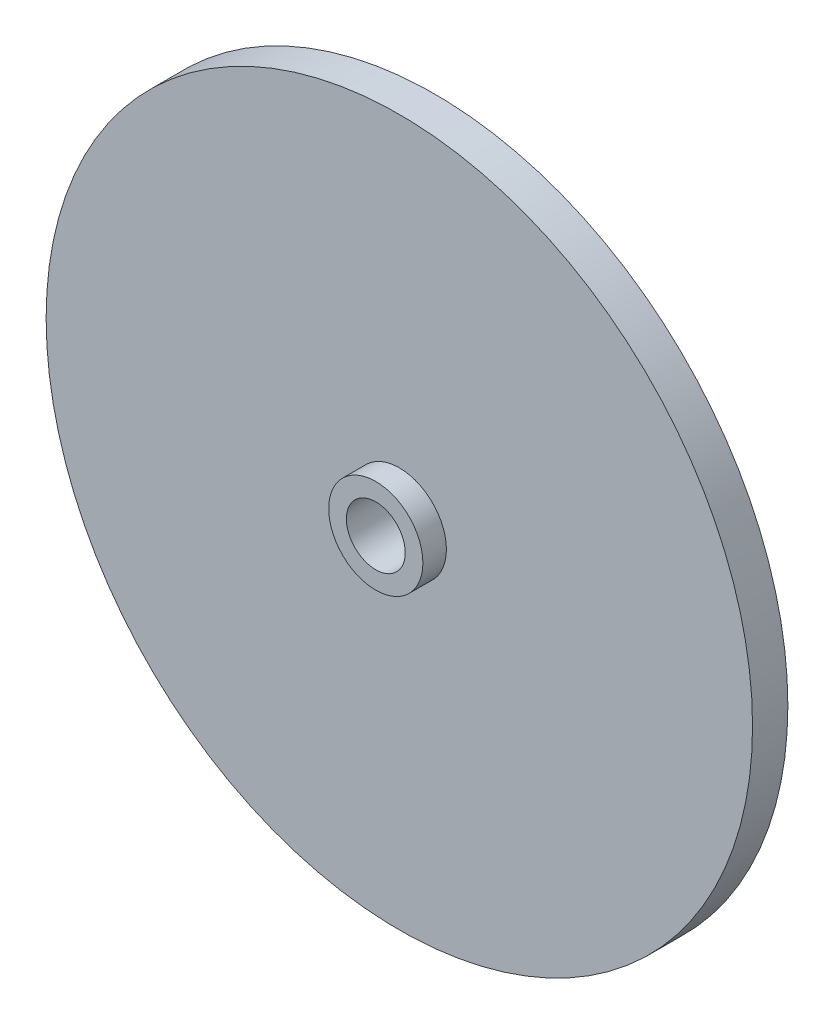
ISO-10303-21;
HEADER;
FILE_DESCRIPTION(('STEP AP214'),'2;1');
FILE_NAME('part.step','',(''),(''),'','','');
FILE_SCHEMA(('AUTOMOTIVE_DESIGN { 1 0 10303 214 1 1 1 1 }'));
ENDSEC;
DATA;
#1=APPLICATION_CONTEXT('core data for automotive mechanical design processes');
#2=APPLICATION_PROTOCOL_DEFINITION('international standard','automotive_design',2000,#1);
#3=PRODUCT_CONTEXT('',#1,'mechanical');
#4=PRODUCT('Part','Part','',(#3));
#5=PRODUCT_RELATED_PRODUCT_CATEGORY('part','',(#4));
#6=PRODUCT_DEFINITION_FORMATION('','',#4);
#7=PRODUCT_DEFINITION_CONTEXT('part definition',#1,'design');
#8=PRODUCT_DEFINITION('design','',#6,#7);
#9=PRODUCT_DEFINITION_SHAPE('','',#8);
#10=(LENGTH_UNIT() NAMED_UNIT(*) SI_UNIT(.MILLI.,.METRE.));
#11=(NAMED_UNIT(*) PLANE_ANGLE_UNIT() SI_UNIT($,.RADIAN.));
#12=(NAMED_UNIT(*) SI_UNIT($,.STERADIAN.) SOLID_ANGLE_UNIT());
#13=UNCERTAINTY_MEASURE_WITH_UNIT(LENGTH_MEASURE(1.E-05),#10,'distance_accuracy_value','');
#14=(GEOMETRIC_REPRESENTATION_CONTEXT(3) GLOBAL_UNCERTAINTY_ASSIGNED_CONTEXT((#13)) GLOBAL_UNIT_ASSIGNED_CONTEXT((#10,
#11,#12)) REPRESENTATION_CONTEXT('',''));
#15=CARTESIAN_POINT('',(0.,0.,0.));
#16=DIRECTION('',(0.,0.,1.));
#17=DIRECTION('',(1.,0.,0.));
#18=AXIS2_PLACEMENT_3D('',#15,#16,#17);
#19=CARTESIAN_POINT('',(0.,0.,25.));
#20=DIRECTION('',(0.,0.,1.));
#21=DIRECTION('',(1.,0.,0.));
#22=AXIS2_PLACEMENT_3D('',#19,#20,#21);
#23=PLANE('',#22);
#24=CARTESIAN_POINT('',(0.,0.,25.));
#25=DIRECTION('',(0.,0.,1.));
#26=DIRECTION('',(1.,0.,0.));
#27=AXIS2_PLACEMENT_3D('',#24,#25,#26);
#28=CIRCLE('',#27,20.);
#29=CARTESIAN_POINT('',(20.,0.,25.));
#30=VERTEX_POINT('',#29);
#31=EDGE_CURVE('E19',#30,#30,#28,.T.);
#32=ORIENTED_EDGE('',*,*,#31,.F.);
#33=EDGE_LOOP('',(#32));
#34=FACE_BOUND('',#33,.T.);
#35=CARTESIAN_POINT('',(0.,0.,25.));
#36=DIRECTION('',(0.,0.,1.));
#37=DIRECTION('',(1.,0.,0.));
#38=AXIS2_PLACEMENT_3D('',#35,#36,#37);
#39=CIRCLE('',#38,150.);
#40=CARTESIAN_POINT('',(150.,0.,25.));
#41=VERTEX_POINT('',#40);
#42=EDGE_CURVE('E42',#41,#41,#39,.T.);
#43=ORIENTED_EDGE('',*,*,#42,.T.);
#44=EDGE_LOOP('',(#43));
#45=FACE_BOUND('',#44,.T.);
#46=ADVANCED_FACE('F16',(#34,#45),#23,.T.);
#47=CARTESIAN_POINT('',(0.,0.,25.));
#48=DIRECTION('',(0.,0.,1.));
#49=DIRECTION('',(1.,0.,0.));
#50=AXIS2_PLACEMENT_3D('',#47,#48,#49);
#51=CYLINDRICAL_SURFACE('',#50,20.);
#52=ORIENTED_EDGE('',*,*,#31,.T.);
#53=DIRECTION('',(0.,0.,1.));
#54=VECTOR('',#53,1.);
#55=CARTESIAN_POINT('',(20.,0.,25.));
#56=LINE('',#55,#54);
#57=CARTESIAN_POINT('',(20.,0.,35.));
#58=VERTEX_POINT('',#57);
#59=EDGE_CURVE('E10',#30,#58,#56,.T.);
#60=ORIENTED_EDGE('',*,*,#59,.T.);
#61=CARTESIAN_POINT('',(0.,0.,35.));
#62=DIRECTION('',(0.,0.,1.));
#63=DIRECTION('',(1.,0.,0.));
#64=AXIS2_PLACEMENT_3D('',#61,#62,#63);
#65=CIRCLE('',#64,20.);
#66=EDGE_CURVE('E319',#58,#58,#65,.T.);
#67=ORIENTED_EDGE('',*,*,#66,.F.);
#68=ORIENTED_EDGE('',*,*,#59,.F.);
#69=EDGE_LOOP('',(#52,#60,#67,#68));
#70=FACE_BOUND('',#69,.T.);
#71=ADVANCED_FACE('F332',(#70),#51,.T.);
#72=CARTESIAN_POINT('',(0.,0.,10.));
#73=DIRECTION('',(0.,0.,1.));
#74=DIRECTION('',(1.,0.,0.));
#75=AXIS2_PLACEMENT_3D('',#72,#73,#74);
#76=CYLINDRICAL_SURFACE('',#75,150.);
#77=CARTESIAN_POINT('',(0.,0.,10.));
#78=DIRECTION('',(0.,0.,1.));
#79=DIRECTION('',(1.,0.,0.));
#80=AXIS2_PLACEMENT_3D('',#77,#78,#79);
#81=CIRCLE('',#80,150.);
#82=CARTESIAN_POINT('',(150.,0.,10.));
#83=VERTEX_POINT('',#82);
#84=EDGE_CURVE('E312',#83,#83,#81,.T.);
#85=ORIENTED_EDGE('',*,*,#84,.T.);
#86=DIRECTION('',(0.,0.,1.));
#87=VECTOR('',#86,1.);
#88=CARTESIAN_POINT('',(150.,0.,10.));
#89=LINE('',#88,#87);
#90=EDGE_CURVE('E323',#83,#41,#89,.T.);
#91=ORIENTED_EDGE('',*,*,#90,.T.);
#92=ORIENTED_EDGE('',*,*,#42,.F.);
#93=ORIENTED_EDGE('',*,*,#90,.F.);
#94=EDGE_LOOP('',(#85,#91,#92,#93));
#95=FACE_BOUND('',#94,.T.);
#96=ADVANCED_FACE('F339',(#95),#76,.T.);
#97=CARTESIAN_POINT('',(0.,0.,0.));
#98=DIRECTION('',(0.,0.,1.));
#99=DIRECTION('',(1.,0.,0.));
#100=AXIS2_PLACEMENT_3D('',#97,#98,#99);
#101=CYLINDRICAL_SURFACE('',#100,20.);
#102=DIRECTION('',(0.,0.,1.));
#103=VECTOR('',#102,1.);
#104=CARTESIAN_POINT('',(-1.5,19.943670675179,0.));
#105=LINE('',#104,#103);
#106=CARTESIAN_POINT('',(-1.5,19.943670675179,0.));
#107=VERTEX_POINT('',#106);
#108=CARTESIAN_POINT('',(-1.5,19.943670675179,10.));
#109=VERTEX_POINT('',#108);
#110=EDGE_CURVE('E283',#107,#109,#105,.T.);
#111=ORIENTED_EDGE('',*,*,#110,.F.);
#112=CARTESIAN_POINT('',(0.,0.,0.));
#113=DIRECTION('',(0.,0.,1.));
#114=DIRECTION('',(1.,0.,0.));
#115=AXIS2_PLACEMENT_3D('',#112,#113,#114);
#116=CIRCLE('',#115,20.);
#117=CARTESIAN_POINT('',(-1.5,-19.94367067517,0.));
#118=VERTEX_POINT('',#117);
#119=EDGE_CURVE('E203',#107,#118,#116,.T.);
#120=ORIENTED_EDGE('',*,*,#119,.T.);
#121=DIRECTION('',(0.,0.,1.));
#122=VECTOR('',#121,1.);
#123=CARTESIAN_POINT('',(-1.5,-19.94367067517,0.));
#124=LINE('',#123,#122);
#125=CARTESIAN_POINT('',(-1.5,-19.94367067517,10.));
#126=VERTEX_POINT('',#125);
#127=EDGE_CURVE('E297',#118,#126,#124,.T.);
#128=ORIENTED_EDGE('',*,*,#127,.T.);
#129=CARTESIAN_POINT('',(0.,0.,10.));
#130=DIRECTION('',(0.,0.,1.));
#131=DIRECTION('',(1.,0.,0.));
#132=AXIS2_PLACEMENT_3D('',#129,#130,#131);
#133=CIRCLE('',#132,20.);
#134=EDGE_CURVE('E316',#109,#126,#133,.T.);
#135=ORIENTED_EDGE('',*,*,#134,.F.);
#136=EDGE_LOOP('',(#111,#120,#128,#135));
#137=FACE_BOUND('',#136,.T.);
#138=ADVANCED_FACE('F344',(#137),#101,.T.);
#139=CARTESIAN_POINT('',(0.,0.,20.));
#140=DIRECTION('',(0.,0.,1.));
#141=DIRECTION('',(1.,0.,0.));
#142=AXIS2_PLACEMENT_3D('',#139,#140,#141);
#143=PLANE('',#142);
#144=DIRECTION('',(0.,-1.,0.));
#145=VECTOR('',#144,1.);
#146=CARTESIAN_POINT('',(-1.5,60.,20.));
#147=LINE('',#146,#145);
#148=CARTESIAN_POINT('',(-1.5,12.409673645991,20.));
#149=VERTEX_POINT('',#148);
#150=CARTESIAN_POINT('',(-1.5,-12.40967364599,20.));
#151=VERTEX_POINT('',#150);
#152=EDGE_CURVE('E245',#149,#151,#147,.T.);
#153=ORIENTED_EDGE('',*,*,#152,.T.);
#154=CARTESIAN_POINT('',(0.,0.,20.));
#155=DIRECTION('',(0.,0.,-1.));
#156=DIRECTION('',(1.,0.,0.));
#157=AXIS2_PLACEMENT_3D('',#154,#155,#156);
#158=CIRCLE('',#157,12.5);
#159=CARTESIAN_POINT('',(1.5,-12.40967364599,20.));
#160=VERTEX_POINT('',#159);
#161=EDGE_CURVE('E220',#160,#151,#158,.T.);
#162=ORIENTED_EDGE('',*,*,#161,.F.);
#163=DIRECTION('',(0.,1.,0.));
#164=VECTOR('',#163,1.);
#165=CARTESIAN_POINT('',(1.5,-60.,20.));
#166=LINE('',#165,#164);
#167=CARTESIAN_POINT('',(1.5,12.409673645991,20.));
#168=VERTEX_POINT('',#167);
#169=EDGE_CURVE('E267',#160,#168,#166,.T.);
#170=ORIENTED_EDGE('',*,*,#169,.T.);
#171=CARTESIAN_POINT('',(0.,0.,20.));
#172=DIRECTION('',(0.,0.,-1.));
#173=DIRECTION('',(1.,0.,0.));
#174=AXIS2_PLACEMENT_3D('',#171,#172,#173);
#175=CIRCLE('',#174,12.5);
#176=EDGE_CURVE('E257',#149,#168,#175,.T.);
#177=ORIENTED_EDGE('',*,*,#176,.F.);
#178=EDGE_LOOP('',(#153,#162,#170,#177));
#179=FACE_BOUND('',#178,.T.);
#180=ADVANCED_FACE('F356',(#179),#143,.T.);
#181=CARTESIAN_POINT('',(0.,0.,35.));
#182=DIRECTION('',(0.,0.,1.));
#183=DIRECTION('',(1.,0.,0.));
#184=AXIS2_PLACEMENT_3D('',#181,#182,#183);
#185=PLANE('',#184);
#186=CARTESIAN_POINT('',(0.,0.,35.));
#187=DIRECTION('',(0.,0.,-1.));
#188=DIRECTION('',(1.,0.,0.));
#189=AXIS2_PLACEMENT_3D('',#186,#187,#188);
#190=CIRCLE('',#189,12.5);
#191=CARTESIAN_POINT('',(12.5,0.,35.));
#192=VERTEX_POINT('',#191);
#193=EDGE_CURVE('E264',#192,#192,#190,.T.);
#194=ORIENTED_EDGE('',*,*,#193,.T.);
#195=EDGE_LOOP('',(#194));
#196=FACE_BOUND('',#195,.T.);
#197=ORIENTED_EDGE('',*,*,#66,.T.);
#198=EDGE_LOOP('',(#197));
#199=FACE_BOUND('',#198,.T.);
#200=ADVANCED_FACE('F354',(#196,#199),#185,.T.);
#201=CARTESIAN_POINT('',(0.,0.,10.));
#202=DIRECTION('',(0.,0.,1.));
#203=DIRECTION('',(1.,0.,0.));
#204=AXIS2_PLACEMENT_3D('',#201,#202,#203);
#205=PLANE('',#204);
#206=DIRECTION('',(0.,1.,0.));
#207=VECTOR('',#206,1.);
#208=CARTESIAN_POINT('',(1.5,-30.,10.));
#209=LINE('',#208,#207);
#210=CARTESIAN_POINT('',(1.5,-60.,10.));
#211=VERTEX_POINT('',#210);
#212=CARTESIAN_POINT('',(1.5,-19.94367067517,10.));
#213=VERTEX_POINT('',#212);
#214=EDGE_CURVE('E309',#211,#213,#209,.T.);
#215=ORIENTED_EDGE('',*,*,#214,.T.);
#216=CARTESIAN_POINT('',(0.,0.,10.));
#217=DIRECTION('',(0.,0.,-1.));
#218=DIRECTION('',(0.0749999999999967,0.997183533758957,0.));
#219=AXIS2_PLACEMENT_3D('',#216,#217,#218);
#220=CIRCLE('',#219,20.);
#221=CARTESIAN_POINT('',(1.5,19.943670675179,10.));
#222=VERTEX_POINT('',#221);
#223=EDGE_CURVE('E233',#222,#213,#220,.T.);
#224=ORIENTED_EDGE('',*,*,#223,.F.);
#225=DIRECTION('',(0.,1.,0.));
#226=VECTOR('',#225,1.);
#227=CARTESIAN_POINT('',(1.5,-30.,10.));
#228=LINE('',#227,#226);
#229=CARTESIAN_POINT('',(1.5,60.,10.));
#230=VERTEX_POINT('',#229);
#231=EDGE_CURVE('E164',#222,#230,#228,.T.);
#232=ORIENTED_EDGE('',*,*,#231,.T.);
#233=DIRECTION('',(-1.,0.,0.));
#234=VECTOR('',#233,1.);
#235=CARTESIAN_POINT('',(0.75,60.,10.));
#236=LINE('',#235,#234);
#237=CARTESIAN_POINT('',(-1.5,60.,10.));
#238=VERTEX_POINT('',#237);
#239=EDGE_CURVE('E279',#230,#238,#236,.T.);
#240=ORIENTED_EDGE('',*,*,#239,.T.);
#241=DIRECTION('',(0.,-1.,0.));
#242=VECTOR('',#241,1.);
#243=CARTESIAN_POINT('',(-1.5,30.,10.));
#244=LINE('',#243,#242);
#245=EDGE_CURVE('E249',#238,#109,#244,.T.);
#246=ORIENTED_EDGE('',*,*,#245,.T.);
#247=ORIENTED_EDGE('',*,*,#134,.T.);
#248=DIRECTION('',(0.,-1.,0.));
#249=VECTOR('',#248,1.);
#250=CARTESIAN_POINT('',(-1.5,30.,10.));
#251=LINE('',#250,#249);
#252=CARTESIAN_POINT('',(-1.5,-60.,10.));
#253=VERTEX_POINT('',#252);
#254=EDGE_CURVE('E293',#126,#253,#251,.T.);
#255=ORIENTED_EDGE('',*,*,#254,.T.);
#256=DIRECTION('',(1.,0.,0.));
#257=VECTOR('',#256,1.);
#258=CARTESIAN_POINT('',(-0.75,-60.,10.));
#259=LINE('',#258,#257);
#260=EDGE_CURVE('E305',#253,#211,#259,.T.);
#261=ORIENTED_EDGE('',*,*,#260,.T.);
#262=EDGE_LOOP('',(#215,#224,#232,#240,#246,#247,#255,#261));
#263=FACE_BOUND('',#262,.T.);
#264=ORIENTED_EDGE('',*,*,#84,.F.);
#265=EDGE_LOOP('',(#264));
#266=FACE_BOUND('',#265,.T.);
#267=ADVANCED_FACE('F350',(#263,#266),#205,.F.);
#268=CARTESIAN_POINT('',(1.5,-60.,0.));
#269=DIRECTION('',(-1.,0.,0.));
#270=DIRECTION('',(0.,0.,1.));
#271=AXIS2_PLACEMENT_3D('',#268,#269,#270);
#272=PLANE('',#271);
#273=DIRECTION('',(0.,0.,1.));
#274=VECTOR('',#273,1.);
#275=CARTESIAN_POINT('',(1.5,-19.94367067517,0.));
#276=LINE('',#275,#274);
#277=CARTESIAN_POINT('',(1.5,-19.94367067517,0.));
#278=VERTEX_POINT('',#277);
#279=EDGE_CURVE('E171',#278,#213,#276,.T.);
#280=ORIENTED_EDGE('',*,*,#279,.T.);
#281=ORIENTED_EDGE('',*,*,#214,.F.);
#282=DIRECTION('',(0.,0.,1.));
#283=VECTOR('',#282,1.);
#284=CARTESIAN_POINT('',(1.5,-60.,0.));
#285=LINE('',#284,#283);
#286=CARTESIAN_POINT('',(1.5,-60.,0.));
#287=VERTEX_POINT('',#286);
#288=EDGE_CURVE('E301',#287,#211,#285,.T.);
#289=ORIENTED_EDGE('',*,*,#288,.F.);
#290=DIRECTION('',(0.,1.,0.));
#291=VECTOR('',#290,1.);
#292=CARTESIAN_POINT('',(1.5,-60.,0.));
#293=LINE('',#292,#291);
#294=EDGE_CURVE('E188',#287,#278,#293,.T.);
#295=ORIENTED_EDGE('',*,*,#294,.T.);
#296=EDGE_LOOP('',(#280,#281,#289,#295));
#297=FACE_BOUND('',#296,.T.);
#298=ADVANCED_FACE('F353',(#297),#272,.F.);
#299=CARTESIAN_POINT('',(-1.5,-60.,0.));
#300=DIRECTION('',(0.,1.,0.));
#301=DIRECTION('',(1.,0.,0.));
#302=AXIS2_PLACEMENT_3D('',#299,#300,#301);
#303=PLANE('',#302);
#304=ORIENTED_EDGE('',*,*,#288,.T.);
#305=ORIENTED_EDGE('',*,*,#260,.F.);
#306=DIRECTION('',(0.,0.,1.));
#307=VECTOR('',#306,1.);
#308=CARTESIAN_POINT('',(-1.5,-60.,0.));
#309=LINE('',#308,#307);
#310=CARTESIAN_POINT('',(-1.5,-60.,0.));
#311=VERTEX_POINT('',#310);
#312=EDGE_CURVE('E248',#311,#253,#309,.T.);
#313=ORIENTED_EDGE('',*,*,#312,.F.);
#314=DIRECTION('',(1.,0.,0.));
#315=VECTOR('',#314,1.);
#316=CARTESIAN_POINT('',(-1.5,-60.,0.));
#317=LINE('',#316,#315);
#318=EDGE_CURVE('E193',#311,#287,#317,.T.);
#319=ORIENTED_EDGE('',*,*,#318,.T.);
#320=EDGE_LOOP('',(#304,#305,#313,#319));
#321=FACE_BOUND('',#320,.T.);
#322=ADVANCED_FACE('F387',(#321),#303,.F.);
#323=CARTESIAN_POINT('',(-1.5,60.,0.));
#324=DIRECTION('',(1.,0.,0.));
#325=DIRECTION('',(0.,1.,0.));
#326=AXIS2_PLACEMENT_3D('',#323,#324,#325);
#327=PLANE('',#326);
#328=ORIENTED_EDGE('',*,*,#312,.T.);
#329=ORIENTED_EDGE('',*,*,#254,.F.);
#330=ORIENTED_EDGE('',*,*,#127,.F.);
#331=DIRECTION('',(0.,-1.,0.));
#332=VECTOR('',#331,1.);
#333=CARTESIAN_POINT('',(-1.5,60.,0.));
#334=LINE('',#333,#332);
#335=EDGE_CURVE('E198',#118,#311,#334,.T.);
#336=ORIENTED_EDGE('',*,*,#335,.T.);
#337=EDGE_LOOP('',(#328,#329,#330,#336));
#338=FACE_BOUND('',#337,.T.);
#339=ADVANCED_FACE('F370',(#338),#327,.F.);
#340=CARTESIAN_POINT('',(-1.5,60.,0.));
#341=DIRECTION('',(1.,0.,0.));
#342=DIRECTION('',(0.,1.,0.));
#343=AXIS2_PLACEMENT_3D('',#340,#341,#342);
#344=PLANE('',#343);
#345=DIRECTION('',(0.,0.,-1.));
#346=VECTOR('',#345,1.);
#347=CARTESIAN_POINT('',(-1.5,-12.40967364599,0.));
#348=LINE('',#347,#346);
#349=CARTESIAN_POINT('',(-1.5,-12.40967364599,0.));
#350=VERTEX_POINT('',#349);
#351=EDGE_CURVE('E216',#151,#350,#348,.T.);
#352=ORIENTED_EDGE('',*,*,#351,.F.);
#353=ORIENTED_EDGE('',*,*,#152,.F.);
#354=DIRECTION('',(0.,0.,-1.));
#355=VECTOR('',#354,1.);
#356=CARTESIAN_POINT('',(-1.5,12.409673645991,0.));
#357=LINE('',#356,#355);
#358=CARTESIAN_POINT('',(-1.5,12.409673645991,0.));
#359=VERTEX_POINT('',#358);
#360=EDGE_CURVE('E219',#149,#359,#357,.T.);
#361=ORIENTED_EDGE('',*,*,#360,.T.);
#362=DIRECTION('',(0.,-1.,0.));
#363=VECTOR('',#362,1.);
#364=CARTESIAN_POINT('',(-1.5,60.,0.));
#365=LINE('',#364,#363);
#366=EDGE_CURVE('E228',#359,#350,#365,.T.);
#367=ORIENTED_EDGE('',*,*,#366,.T.);
#368=EDGE_LOOP('',(#352,#353,#361,#367));
#369=FACE_BOUND('',#368,.T.);
#370=ADVANCED_FACE('F348',(#369),#344,.F.);
#371=CARTESIAN_POINT('',(-1.5,60.,0.));
#372=DIRECTION('',(1.,0.,0.));
#373=DIRECTION('',(0.,1.,0.));
#374=AXIS2_PLACEMENT_3D('',#371,#372,#373);
#375=PLANE('',#374);
#376=ORIENTED_EDGE('',*,*,#110,.T.);
#377=ORIENTED_EDGE('',*,*,#245,.F.);
#378=DIRECTION('',(0.,0.,1.));
#379=VECTOR('',#378,1.);
#380=CARTESIAN_POINT('',(-1.5,60.,0.));
#381=LINE('',#380,#379);
#382=CARTESIAN_POINT('',(-1.5,60.,0.));
#383=VERTEX_POINT('',#382);
#384=EDGE_CURVE('E275',#383,#238,#381,.T.);
#385=ORIENTED_EDGE('',*,*,#384,.F.);
#386=DIRECTION('',(0.,-1.,0.));
#387=VECTOR('',#386,1.);
#388=CARTESIAN_POINT('',(-1.5,60.,0.));
#389=LINE('',#388,#387);
#390=EDGE_CURVE('E199',#383,#107,#389,.T.);
#391=ORIENTED_EDGE('',*,*,#390,.T.);
#392=EDGE_LOOP('',(#376,#377,#385,#391));
#393=FACE_BOUND('',#392,.T.);
#394=ADVANCED_FACE('F367',(#393),#375,.F.);
#395=CARTESIAN_POINT('',(1.5,60.,0.));
#396=DIRECTION('',(0.,-1.,0.));
#397=DIRECTION('',(0.,0.,-1.));
#398=AXIS2_PLACEMENT_3D('',#395,#396,#397);
#399=PLANE('',#398);
#400=ORIENTED_EDGE('',*,*,#384,.T.);
#401=ORIENTED_EDGE('',*,*,#239,.F.);
#402=DIRECTION('',(0.,0.,1.));
#403=VECTOR('',#402,1.);
#404=CARTESIAN_POINT('',(1.5,60.,0.));
#405=LINE('',#404,#403);
#406=CARTESIAN_POINT('',(1.5,60.,0.));
#407=VERTEX_POINT('',#406);
#408=EDGE_CURVE('E270',#407,#230,#405,.T.);
#409=ORIENTED_EDGE('',*,*,#408,.F.);
#410=DIRECTION('',(-1.,0.,0.));
#411=VECTOR('',#410,1.);
#412=CARTESIAN_POINT('',(1.5,60.,0.));
#413=LINE('',#412,#411);
#414=EDGE_CURVE('E180',#407,#383,#413,.T.);
#415=ORIENTED_EDGE('',*,*,#414,.T.);
#416=EDGE_LOOP('',(#400,#401,#409,#415));
#417=FACE_BOUND('',#416,.T.);
#418=ADVANCED_FACE('F374',(#417),#399,.F.);
#419=CARTESIAN_POINT('',(1.5,-60.,0.));
#420=DIRECTION('',(-1.,0.,0.));
#421=DIRECTION('',(0.,0.,1.));
#422=AXIS2_PLACEMENT_3D('',#419,#420,#421);
#423=PLANE('',#422);
#424=ORIENTED_EDGE('',*,*,#408,.T.);
#425=ORIENTED_EDGE('',*,*,#231,.F.);
#426=DIRECTION('',(0.,0.,1.));
#427=VECTOR('',#426,1.);
#428=CARTESIAN_POINT('',(1.5,19.943670675179,0.));
#429=LINE('',#428,#427);
#430=CARTESIAN_POINT('',(1.5,19.943670675179,0.));
#431=VERTEX_POINT('',#430);
#432=EDGE_CURVE('E157',#431,#222,#429,.T.);
#433=ORIENTED_EDGE('',*,*,#432,.F.);
#434=DIRECTION('',(0.,1.,0.));
#435=VECTOR('',#434,1.);
#436=CARTESIAN_POINT('',(1.5,-60.,0.));
#437=LINE('',#436,#435);
#438=EDGE_CURVE('E161',#431,#407,#437,.T.);
#439=ORIENTED_EDGE('',*,*,#438,.T.);
#440=EDGE_LOOP('',(#424,#425,#433,#439));
#441=FACE_BOUND('',#440,.T.);
#442=ADVANCED_FACE('F160',(#441),#423,.F.);
#443=CARTESIAN_POINT('',(1.5,-60.,0.));
#444=DIRECTION('',(-1.,0.,0.));
#445=DIRECTION('',(0.,0.,1.));
#446=AXIS2_PLACEMENT_3D('',#443,#444,#445);
#447=PLANE('',#446);
#448=DIRECTION('',(0.,0.,-1.));
#449=VECTOR('',#448,1.);
#450=CARTESIAN_POINT('',(1.5,12.409673645991,0.));
#451=LINE('',#450,#449);
#452=CARTESIAN_POINT('',(1.5,12.409673645991,0.));
#453=VERTEX_POINT('',#452);
#454=EDGE_CURVE('E261',#168,#453,#451,.T.);
#455=ORIENTED_EDGE('',*,*,#454,.F.);
#456=ORIENTED_EDGE('',*,*,#169,.F.);
#457=DIRECTION('',(0.,0.,-1.));
#458=VECTOR('',#457,1.);
#459=CARTESIAN_POINT('',(1.5,-12.40967364599,0.));
#460=LINE('',#459,#458);
#461=CARTESIAN_POINT('',(1.5,-12.40967364599,0.));
#462=VERTEX_POINT('',#461);
#463=EDGE_CURVE('E244',#160,#462,#460,.T.);
#464=ORIENTED_EDGE('',*,*,#463,.T.);
#465=DIRECTION('',(0.,1.,0.));
#466=VECTOR('',#465,1.);
#467=CARTESIAN_POINT('',(1.5,-60.,0.));
#468=LINE('',#467,#466);
#469=EDGE_CURVE('E213',#462,#453,#468,.T.);
#470=ORIENTED_EDGE('',*,*,#469,.T.);
#471=EDGE_LOOP('',(#455,#456,#464,#470));
#472=FACE_BOUND('',#471,.T.);
#473=ADVANCED_FACE('F381',(#472),#447,.F.);
#474=CARTESIAN_POINT('',(0.,0.,0.));
#475=DIRECTION('',(0.,0.,-1.));
#476=DIRECTION('',(1.,0.,0.));
#477=AXIS2_PLACEMENT_3D('',#474,#475,#476);
#478=CYLINDRICAL_SURFACE('',#477,12.5);
#479=DIRECTION('',(0.,0.,1.));
#480=VECTOR('',#479,1.);
#481=CARTESIAN_POINT('',(12.5,0.,0.));
#482=LINE('',#481,#480);
#483=CARTESIAN_POINT('',(12.5,0.,0.));
#484=VERTEX_POINT('',#483);
#485=EDGE_CURVE('E170',#484,#192,#482,.T.);
#486=ORIENTED_EDGE('',*,*,#485,.F.);
#487=CARTESIAN_POINT('',(0.,0.,0.));
#488=DIRECTION('',(0.,0.,1.));
#489=DIRECTION('',(1.,0.,0.));
#490=AXIS2_PLACEMENT_3D('',#487,#488,#489);
#491=CIRCLE('',#490,12.5);
#492=EDGE_CURVE('E224',#462,#484,#491,.T.);
#493=ORIENTED_EDGE('',*,*,#492,.F.);
#494=ORIENTED_EDGE('',*,*,#463,.F.);
#495=ORIENTED_EDGE('',*,*,#161,.T.);
#496=ORIENTED_EDGE('',*,*,#351,.T.);
#497=CARTESIAN_POINT('',(0.,0.,0.));
#498=DIRECTION('',(0.,0.,1.));
#499=DIRECTION('',(1.,0.,0.));
#500=AXIS2_PLACEMENT_3D('',#497,#498,#499);
#501=CIRCLE('',#500,12.5);
#502=EDGE_CURVE('E232',#359,#350,#501,.T.);
#503=ORIENTED_EDGE('',*,*,#502,.F.);
#504=ORIENTED_EDGE('',*,*,#360,.F.);
#505=ORIENTED_EDGE('',*,*,#176,.T.);
#506=ORIENTED_EDGE('',*,*,#454,.T.);
#507=CARTESIAN_POINT('',(0.,0.,0.));
#508=DIRECTION('',(0.,0.,1.));
#509=DIRECTION('',(1.,0.,0.));
#510=AXIS2_PLACEMENT_3D('',#507,#508,#509);
#511=CIRCLE('',#510,12.5);
#512=EDGE_CURVE('E182',#484,#453,#511,.T.);
#513=ORIENTED_EDGE('',*,*,#512,.F.);
#514=ORIENTED_EDGE('',*,*,#485,.T.);
#515=ORIENTED_EDGE('',*,*,#193,.F.);
#516=EDGE_LOOP('',(#486,#493,#494,#495,#496,#503,#504,#505,#506,#513,#514,#515));
#517=FACE_BOUND('',#516,.T.);
#518=ADVANCED_FACE('F405',(#517),#478,.F.);
#519=CARTESIAN_POINT('',(0.,0.,0.));
#520=DIRECTION('',(0.,0.,1.));
#521=DIRECTION('',(1.,0.,0.));
#522=AXIS2_PLACEMENT_3D('',#519,#520,#521);
#523=CYLINDRICAL_SURFACE('',#522,20.);
#524=ORIENTED_EDGE('',*,*,#223,.T.);
#525=ORIENTED_EDGE('',*,*,#279,.F.);
#526=CARTESIAN_POINT('',(0.,0.,0.));
#527=DIRECTION('',(0.,0.,-1.));
#528=DIRECTION('',(0.0749999999999967,0.997183533758957,0.));
#529=AXIS2_PLACEMENT_3D('',#526,#527,#528);
#530=CIRCLE('',#529,20.);
#531=EDGE_CURVE('E177',#431,#278,#530,.T.);
#532=ORIENTED_EDGE('',*,*,#531,.F.);
#533=ORIENTED_EDGE('',*,*,#432,.T.);
#534=EDGE_LOOP('',(#524,#525,#532,#533));
#535=FACE_BOUND('',#534,.T.);
#536=ADVANCED_FACE('F184',(#535),#523,.T.);
#537=CARTESIAN_POINT('',(0.,0.,0.));
#538=DIRECTION('',(0.,0.,1.));
#539=DIRECTION('',(1.,0.,0.));
#540=AXIS2_PLACEMENT_3D('',#537,#538,#539);
#541=PLANE('',#540);
#542=ORIENTED_EDGE('',*,*,#366,.F.);
#543=ORIENTED_EDGE('',*,*,#502,.T.);
#544=EDGE_LOOP('',(#542,#543));
#545=FACE_BOUND('',#544,.T.);
#546=ORIENTED_EDGE('',*,*,#512,.T.);
#547=ORIENTED_EDGE('',*,*,#469,.F.);
#548=ORIENTED_EDGE('',*,*,#492,.T.);
#549=EDGE_LOOP('',(#546,#547,#548));
#550=FACE_BOUND('',#549,.T.);
#551=ORIENTED_EDGE('',*,*,#531,.T.);
#552=ORIENTED_EDGE('',*,*,#294,.F.);
#553=ORIENTED_EDGE('',*,*,#318,.F.);
#554=ORIENTED_EDGE('',*,*,#335,.F.);
#555=ORIENTED_EDGE('',*,*,#119,.F.);
#556=ORIENTED_EDGE('',*,*,#390,.F.);
#557=ORIENTED_EDGE('',*,*,#414,.F.);
#558=ORIENTED_EDGE('',*,*,#438,.F.);
#559=EDGE_LOOP('',(#551,#552,#553,#554,#555,#556,#557,#558));
#560=FACE_BOUND('',#559,.T.);
#561=ADVANCED_FACE('F175',(#545,#550,#560),#541,.F.);
#562=CLOSED_SHELL('',(#46,#71,#96,#138,#180,#200,#267,#298,#322,#339,#370,#394,#418,#442,#473,
#518,#536,#561));
#563=MANIFOLD_SOLID_BREP('B1',#562);
#564=ADVANCED_BREP_SHAPE_REPRESENTATION('',(#18,#563),#14);
#565=SHAPE_DEFINITION_REPRESENTATION(#9,#564);
ENDSEC;
END-ISO-10303-21;
